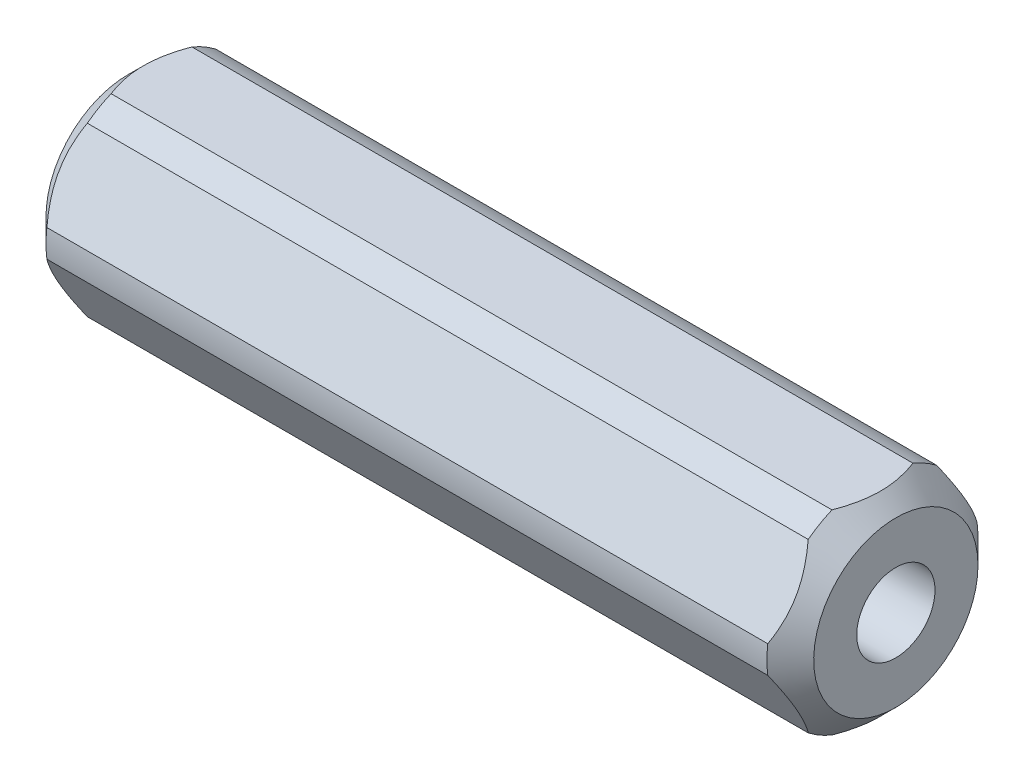
ISO-10303-21;
HEADER;
FILE_DESCRIPTION(('STEP AP214'),'2;1');
FILE_NAME('part.step','',(''),(''),'','','');
FILE_SCHEMA(('AUTOMOTIVE_DESIGN { 1 0 10303 214 1 1 1 1 }'));
ENDSEC;
DATA;
#1=APPLICATION_CONTEXT('core data for automotive mechanical design processes');
#2=APPLICATION_PROTOCOL_DEFINITION('international standard','automotive_design',2000,#1);
#3=PRODUCT_CONTEXT('',#1,'mechanical');
#4=PRODUCT('Part','Part','',(#3));
#5=PRODUCT_RELATED_PRODUCT_CATEGORY('part','',(#4));
#6=PRODUCT_DEFINITION_FORMATION('','',#4);
#7=PRODUCT_DEFINITION_CONTEXT('part definition',#1,'design');
#8=PRODUCT_DEFINITION('design','',#6,#7);
#9=PRODUCT_DEFINITION_SHAPE('','',#8);
#10=(LENGTH_UNIT() NAMED_UNIT(*) SI_UNIT(.MILLI.,.METRE.));
#11=(NAMED_UNIT(*) PLANE_ANGLE_UNIT() SI_UNIT($,.RADIAN.));
#12=(NAMED_UNIT(*) SI_UNIT($,.STERADIAN.) SOLID_ANGLE_UNIT());
#13=UNCERTAINTY_MEASURE_WITH_UNIT(LENGTH_MEASURE(1.E-05),#10,'distance_accuracy_value','');
#14=(GEOMETRIC_REPRESENTATION_CONTEXT(3) GLOBAL_UNCERTAINTY_ASSIGNED_CONTEXT((#13)) GLOBAL_UNIT_ASSIGNED_CONTEXT((#10,
#11,#12)) REPRESENTATION_CONTEXT('',''));
#15=CARTESIAN_POINT('',(0.,0.,0.));
#16=DIRECTION('',(0.,0.,1.));
#17=DIRECTION('',(1.,0.,0.));
#18=AXIS2_PLACEMENT_3D('',#15,#16,#17);
#19=CARTESIAN_POINT('',(25.,0.,0.));
#20=DIRECTION('',(1.,0.,0.));
#21=DIRECTION('',(0.,0.,-1.));
#22=AXIS2_PLACEMENT_3D('',#19,#20,#21);
#23=PLANE('',#22);
#24=CARTESIAN_POINT('',(25.,0.,0.));
#25=DIRECTION('',(1.,0.,0.));
#26=DIRECTION('',(0.,0.,-1.));
#27=AXIS2_PLACEMENT_3D('',#24,#25,#26);
#28=CIRCLE('',#27,2.55);
#29=CARTESIAN_POINT('',(25.,0.,-2.55));
#30=VERTEX_POINT('',#29);
#31=EDGE_CURVE('E264',#30,#30,#28,.T.);
#32=ORIENTED_EDGE('',*,*,#31,.F.);
#33=EDGE_LOOP('',(#32));
#34=FACE_BOUND('',#33,.T.);
#35=CARTESIAN_POINT('',(25.,0.,0.));
#36=DIRECTION('',(1.,0.,0.));
#37=DIRECTION('',(0.,0.,-1.));
#38=AXIS2_PLACEMENT_3D('',#35,#36,#37);
#39=CIRCLE('',#38,5.34999999999999);
#40=CARTESIAN_POINT('',(25.,0.,-5.34999999999999));
#41=VERTEX_POINT('',#40);
#42=EDGE_CURVE('E305',#41,#41,#39,.F.);
#43=ORIENTED_EDGE('',*,*,#42,.F.);
#44=EDGE_LOOP('',(#43));
#45=FACE_BOUND('',#44,.T.);
#46=ADVANCED_FACE('F36',(#34,#45),#23,.T.);
#47=CARTESIAN_POINT('',(-25.,0.,0.));
#48=DIRECTION('',(1.,0.,0.));
#49=DIRECTION('',(0.,0.,-1.));
#50=AXIS2_PLACEMENT_3D('',#47,#48,#49);
#51=PLANE('',#50);
#52=CARTESIAN_POINT('',(-25.,0.,0.));
#53=DIRECTION('',(1.,0.,0.));
#54=DIRECTION('',(0.,0.,-1.));
#55=AXIS2_PLACEMENT_3D('',#52,#53,#54);
#56=CIRCLE('',#55,2.55);
#57=CARTESIAN_POINT('',(-25.,0.,-2.55));
#58=VERTEX_POINT('',#57);
#59=EDGE_CURVE('E267',#58,#58,#56,.T.);
#60=ORIENTED_EDGE('',*,*,#59,.T.);
#61=EDGE_LOOP('',(#60));
#62=FACE_BOUND('',#61,.T.);
#63=CARTESIAN_POINT('',(-25.,0.,0.));
#64=DIRECTION('',(1.,0.,0.));
#65=DIRECTION('',(0.,0.,-1.));
#66=AXIS2_PLACEMENT_3D('',#63,#64,#65);
#67=CIRCLE('',#66,5.35);
#68=CARTESIAN_POINT('',(-25.,0.,-5.35000000000001));
#69=VERTEX_POINT('',#68);
#70=EDGE_CURVE('E261',#69,#69,#67,.F.);
#71=ORIENTED_EDGE('',*,*,#70,.T.);
#72=EDGE_LOOP('',(#71));
#73=FACE_BOUND('',#72,.T.);
#74=ADVANCED_FACE('F237',(#62,#73),#51,.F.);
#75=CARTESIAN_POINT('',(-25.,0.,0.));
#76=DIRECTION('',(1.,0.,0.));
#77=DIRECTION('',(0.,0.,-1.));
#78=AXIS2_PLACEMENT_3D('',#75,#76,#77);
#79=CYLINDRICAL_SURFACE('',#78,2.55);
#80=ORIENTED_EDGE('',*,*,#59,.F.);
#81=EDGE_LOOP('',(#80));
#82=FACE_BOUND('',#81,.T.);
#83=ORIENTED_EDGE('',*,*,#31,.T.);
#84=EDGE_LOOP('',(#83));
#85=FACE_BOUND('',#84,.T.);
#86=ADVANCED_FACE('F194',(#82,#85),#79,.F.);
#87=CARTESIAN_POINT('',(23.,0.,0.));
#88=DIRECTION('',(-1.,0.,0.));
#89=DIRECTION('',(0.,-1.,0.));
#90=AXIS2_PLACEMENT_3D('',#87,#88,#89);
#91=CONICAL_SURFACE('',#90,7.34999999999999,0.78539816339745);
#92=ORIENTED_EDGE('',*,*,#42,.T.);
#93=EDGE_LOOP('',(#92));
#94=FACE_BOUND('',#93,.T.);
#95=CARTESIAN_POINT('',(23.475,0.,0.));
#96=DIRECTION('',(-1.,0.,0.));
#97=DIRECTION('',(0.,-1.,0.));
#98=AXIS2_PLACEMENT_3D('',#95,#96,#97);
#99=CIRCLE('',#98,6.875);
#100=CARTESIAN_POINT('',(23.475,-5.45696050579321,4.18177080173138));
#101=VERTEX_POINT('',#100);
#102=CARTESIAN_POINT('',(23.475,-6.35,2.6349810245997));
#103=VERTEX_POINT('',#102);
#104=EDGE_CURVE('E304',#101,#103,#99,.F.);
#105=ORIENTED_EDGE('',*,*,#104,.T.);
#106=CARTESIAN_POINT('',(22.2439581353573,-6.35,-5.03839406074391));
#107=CARTESIAN_POINT('',(22.3195741219603,-6.35,-4.9167212075727));
#108=CARTESIAN_POINT('',(22.3939976594142,-6.35,-4.79429693604938));
#109=CARTESIAN_POINT('',(22.5400815380457,-6.35,-4.54777236248066));
#110=CARTESIAN_POINT('',(22.61174120379,-6.35,-4.42367166063026));
#111=CARTESIAN_POINT('',(22.7521842054118,-6.35,-4.17314077118514));
#112=CARTESIAN_POINT('',(22.8209537995438,-6.35,-4.04670284391036));
#113=CARTESIAN_POINT('',(22.9547840481854,-6.35,-3.79189401980648));
#114=CARTESIAN_POINT('',(23.0198449411811,-6.35,-3.6635232479405));
#115=CARTESIAN_POINT('',(23.2113872856419,-6.35,-3.26967790405867));
#116=CARTESIAN_POINT('',(23.3311468240079,-6.35,-3.00086462197369));
#117=CARTESIAN_POINT('',(23.5468634656339,-6.35,-2.45416979122341));
#118=CARTESIAN_POINT('',(23.6428635853467,-6.35,-2.17630567708838));
#119=CARTESIAN_POINT('',(23.7687731285972,-6.35,-1.73581597128071));
#120=CARTESIAN_POINT('',(23.8091908547284,-6.35,-1.57618112953531));
#121=CARTESIAN_POINT('',(23.879168231364,-6.35,-1.25450770394683));
#122=CARTESIAN_POINT('',(23.9087273470115,-6.35,-1.09246900210693));
#123=CARTESIAN_POINT('',(23.9556953895091,-6.35,-0.76818847257728));
#124=CARTESIAN_POINT('',(23.9732166504887,-6.35,-0.605963078458843));
#125=CARTESIAN_POINT('',(23.995873484238,-6.35,-0.280640552256999));
#126=CARTESIAN_POINT('',(24.001008734837,-6.35,-0.117543397608938));
#127=CARTESIAN_POINT('',(23.9984538311998,-6.35,0.237960972481487));
#128=CARTESIAN_POINT('',(23.9882863292716,-6.35,0.430354852339885));
#129=CARTESIAN_POINT('',(23.9509477613933,-6.35,0.813488630628858));
#130=CARTESIAN_POINT('',(23.9237732192133,-6.35,1.00422818283275));
#131=CARTESIAN_POINT('',(23.8533898657111,-6.35,1.38527395181799));
#132=CARTESIAN_POINT('',(23.8099755318482,-6.35,1.57554171050399));
#133=CARTESIAN_POINT('',(23.7091558566288,-6.35,1.95224759190602));
#134=CARTESIAN_POINT('',(23.6517527678805,-6.35,2.13868632597373));
#135=CARTESIAN_POINT('',(23.5165670930669,-6.35,2.53217140573025));
#136=CARTESIAN_POINT('',(23.4370839322049,-6.35,2.73862881669699));
#137=CARTESIAN_POINT('',(23.2656657069374,-6.35,3.14635356980783));
#138=CARTESIAN_POINT('',(23.1737249871005,-6.35,3.34761850500479));
#139=CARTESIAN_POINT('',(22.9795333320435,-6.35,3.74587808348406));
#140=CARTESIAN_POINT('',(22.8772500456455,-6.35,3.942856829136));
#141=CARTESIAN_POINT('',(22.6646183582391,-6.35,4.33234428550055));
#142=CARTESIAN_POINT('',(22.5542711855378,-6.35,4.52485367113281));
#143=CARTESIAN_POINT('',(22.3318171829415,-6.35,4.89798257007592));
#144=CARTESIAN_POINT('',(22.2199777355976,-6.35,5.07876232602886));
#145=CARTESIAN_POINT('',(21.9913793968018,-6.35,5.4371942932294));
#146=CARTESIAN_POINT('',(21.874620116551,-6.35,5.61484625571854));
#147=CARTESIAN_POINT('',(21.6380055819828,-6.35,5.96599291825778));
#148=CARTESIAN_POINT('',(21.5181827719405,-6.35,6.13950956033397));
#149=CARTESIAN_POINT('',(21.2752175514028,-6.35,6.48413143949801));
#150=CARTESIAN_POINT('',(21.1520761006711,-6.35,6.65523735243475));
#151=CARTESIAN_POINT('',(21.0275740883058,-6.35,6.825329653506));
#152=B_SPLINE_CURVE_WITH_KNOTS('',3,(#106,#107,#108,#109,#110,#111,#112,#113,#114,#115,#116,
#117,#118,#119,#120,#121,#122,#123,#124,#125,#126,#127,#128,#129,#130,#131,#132,#133,#134,#135,
#136,#137,#138,#139,#140,#141,#142,#143,#144,#145,#146,#147,#148,#149,#150,#151),.UNSPECIFIED.,
.F.,.F.,(4,2,2,2,2,2,2,2,2,2,2,2,2,2,2,2,2,2,2,2,2,2,4),(0.,0.429771247154591,0.859646864545559,
1.29137691978356,1.72307918145949,2.60508831723376,3.48548869672243,3.97918678889613,
4.47290919564488,4.96195934269227,5.45102221021652,6.02819613408464,6.60548807054104,
7.19034769458147,7.77511320088765,8.43829025301613,9.10176938660425,9.76739213074458,
10.4329136964041,11.0705543641275,11.708245517429,12.3408089752114,12.9731914158771),.UNSPECIFIED.);
#153=CARTESIAN_POINT('',(23.475,-6.34999999999999,-2.6349810245996));
#154=VERTEX_POINT('',#153);
#155=EDGE_CURVE('E216',#154,#103,#152,.T.);
#156=ORIENTED_EDGE('',*,*,#155,.F.);
#157=CARTESIAN_POINT('',(23.475,0.,0.));
#158=DIRECTION('',(-1.,0.,0.));
#159=DIRECTION('',(0.,-1.,0.));
#160=AXIS2_PLACEMENT_3D('',#157,#158,#159);
#161=CIRCLE('',#160,6.875);
#162=CARTESIAN_POINT('',(23.475,-5.45696050579321,-4.18177080173139));
#163=VERTEX_POINT('',#162);
#164=EDGE_CURVE('E160',#154,#163,#161,.F.);
#165=ORIENTED_EDGE('',*,*,#164,.T.);
#166=CARTESIAN_POINT('',(23.4749114842835,-0.892839494206784,-6.81686729638483));
#167=CARTESIAN_POINT('',(23.5544158158132,-1.07236532873137,-6.71321800749557));
#168=CARTESIAN_POINT('',(23.6269587202094,-1.25442679768724,-6.60810476938484));
#169=CARTESIAN_POINT('',(23.7552276765301,-1.62345297783122,-6.39504740494069));
#170=CARTESIAN_POINT('',(23.810907023712,-1.81042977564499,-6.2870963003907));
#171=CARTESIAN_POINT('',(23.9004237178134,-2.1812459243031,-6.07300549714308));
#172=CARTESIAN_POINT('',(23.9349828781156,-2.36495142475234,-5.9669430770071));
#173=CARTESIAN_POINT('',(23.9831473488082,-2.73419034728063,-5.7537628856901));
#174=CARTESIAN_POINT('',(23.9967809062925,-2.91972096436872,-5.64664673397137));
#175=CARTESIAN_POINT('',(24.0023641784298,-3.30218953927796,-5.42582839929095));
#176=CARTESIAN_POINT('',(23.9929632444641,-3.49914377711882,-5.31211681705549));
#177=CARTESIAN_POINT('',(23.9503316355953,-3.89135821622141,-5.08567170505955));
#178=CARTESIAN_POINT('',(23.9170641655358,-4.08661532999935,-4.97293995785867));
#179=CARTESIAN_POINT('',(23.8273191931289,-4.48116785790707,-4.7451449496617));
#180=CARTESIAN_POINT('',(23.7699660135684,-4.68031210853098,-4.63016896295642));
#181=CARTESIAN_POINT('',(23.6694106682599,-4.97489640720418,-4.46009063881842));
#182=CARTESIAN_POINT('',(23.6335267488458,-5.07227985912123,-4.40386627663949));
#183=CARTESIAN_POINT('',(23.5573860772987,-5.26571176805271,-4.29218831194804));
#184=CARTESIAN_POINT('',(23.5171312192409,-5.36176078313213,-4.23673438723654));
#185=CARTESIAN_POINT('',(23.4749114842835,-5.45716050579321,-4.18165533167755));
#186=B_SPLINE_CURVE_WITH_KNOTS('',3,(#166,#167,#168,#169,#170,#171,#172,#173,#174,#175,#176,
#177,#178,#179,#180,#181,#182,#183,#184,#185),.UNSPECIFIED.,.F.,.F.,(4,2,2,2,2,2,2,2,2,4),(0.,
0.666305152357756,1.33443915250483,1.9782328854584,2.62115680616373,3.30267097356111,
3.9852380988712,4.69512464711033,5.04915819200856,5.40303892990316),.UNSPECIFIED.);
#187=CARTESIAN_POINT('',(23.475,-0.893039494206784,-6.81675182633099));
#188=VERTEX_POINT('',#187);
#189=EDGE_CURVE('E168',#188,#163,#186,.T.);
#190=ORIENTED_EDGE('',*,*,#189,.F.);
#191=CARTESIAN_POINT('',(23.475,0.,0.));
#192=DIRECTION('',(-1.,0.,0.));
#193=DIRECTION('',(0.,-1.,0.));
#194=AXIS2_PLACEMENT_3D('',#191,#192,#193);
#195=CIRCLE('',#194,6.875);
#196=CARTESIAN_POINT('',(23.475,0.893039494206792,-6.81675182633099));
#197=VERTEX_POINT('',#196);
#198=EDGE_CURVE('E175',#188,#197,#195,.F.);
#199=ORIENTED_EDGE('',*,*,#198,.T.);
#200=CARTESIAN_POINT('',(23.4749114842835,5.45716050579321,-4.18165533167754));
#201=CARTESIAN_POINT('',(23.5544158158132,5.27763467126862,-4.2853046205668));
#202=CARTESIAN_POINT('',(23.6269587202094,5.09557320231276,-4.39041785867753));
#203=CARTESIAN_POINT('',(23.7552276765301,4.72654702216877,-4.60347522312168));
#204=CARTESIAN_POINT('',(23.810907023712,4.539570224355,-4.71142632767168));
#205=CARTESIAN_POINT('',(23.9004237178134,4.1687540756969,-4.92551713091929));
#206=CARTESIAN_POINT('',(23.9349828781156,3.98504857524766,-5.03157955105527));
#207=CARTESIAN_POINT('',(23.9831473488082,3.61580965271937,-5.24475974237227));
#208=CARTESIAN_POINT('',(23.9967809062925,3.43027903563128,-5.351875894091));
#209=CARTESIAN_POINT('',(24.0023641784299,3.04781046072203,-5.57269422877142));
#210=CARTESIAN_POINT('',(23.9929632444641,2.85085622288117,-5.68640581100688));
#211=CARTESIAN_POINT('',(23.9503316355953,2.45864178377859,-5.91285092300282));
#212=CARTESIAN_POINT('',(23.9170641655358,2.26338467000065,-6.0255826702037));
#213=CARTESIAN_POINT('',(23.8273191931289,1.86883214209293,-6.25337767840067));
#214=CARTESIAN_POINT('',(23.7699660135684,1.66968789146901,-6.36835366510595));
#215=CARTESIAN_POINT('',(23.6694106682599,1.37510359279582,-6.53843198924396));
#216=CARTESIAN_POINT('',(23.6335267488458,1.27772014087877,-6.59465635142289));
#217=CARTESIAN_POINT('',(23.5573860772987,1.08428823194729,-6.70633431611434));
#218=CARTESIAN_POINT('',(23.5171312192409,0.988239216867873,-6.76178824082584));
#219=CARTESIAN_POINT('',(23.4749114842835,0.892839494206794,-6.81686729638483));
#220=B_SPLINE_CURVE_WITH_KNOTS('',3,(#200,#201,#202,#203,#204,#205,#206,#207,#208,#209,#210,
#211,#212,#213,#214,#215,#216,#217,#218,#219),.UNSPECIFIED.,.F.,.F.,(4,2,2,2,2,2,2,2,2,4),(0.,
0.666305152357755,1.33443915250483,1.9782328854584,2.62115680616373,3.30267097356111,
3.9852380988712,4.69512464711033,5.04915819200856,5.40303892990316),.UNSPECIFIED.);
#221=CARTESIAN_POINT('',(23.475,5.45696050579321,-4.18177080173138));
#222=VERTEX_POINT('',#221);
#223=EDGE_CURVE('E59',#222,#197,#220,.T.);
#224=ORIENTED_EDGE('',*,*,#223,.F.);
#225=CARTESIAN_POINT('',(23.475,0.,0.));
#226=DIRECTION('',(-1.,0.,0.));
#227=DIRECTION('',(0.,-1.,0.));
#228=AXIS2_PLACEMENT_3D('',#225,#226,#227);
#229=CIRCLE('',#228,6.875);
#230=CARTESIAN_POINT('',(23.475,6.35000000000001,-2.63498102459961));
#231=VERTEX_POINT('',#230);
#232=EDGE_CURVE('E45',#222,#231,#229,.F.);
#233=ORIENTED_EDGE('',*,*,#232,.T.);
#234=CARTESIAN_POINT('',(22.2439581353433,6.35,-5.03839406076657));
#235=CARTESIAN_POINT('',(22.3195741219468,6.35,-4.91672120759479));
#236=CARTESIAN_POINT('',(22.3939976594013,6.35,-4.79429693607089));
#237=CARTESIAN_POINT('',(22.5400815380339,6.35,-4.547772362501));
#238=CARTESIAN_POINT('',(22.6117412037787,6.35,-4.42367166065001));
#239=CARTESIAN_POINT('',(22.7521842054017,6.35,-4.17314077120369));
#240=CARTESIAN_POINT('',(22.8209537995342,6.35,-4.04670284392831));
#241=CARTESIAN_POINT('',(22.9547840481769,6.35,-3.79189401982319));
#242=CARTESIAN_POINT('',(23.0198449411731,6.35,-3.66352324795659));
#243=CARTESIAN_POINT('',(23.2113872856354,6.35,-3.26967790407277));
#244=CARTESIAN_POINT('',(23.3311468240025,6.35,-3.00086462198639));
#245=CARTESIAN_POINT('',(23.5468634656304,6.35,-2.45416979123321));
#246=CARTESIAN_POINT('',(23.6428635853441,6.35,-2.17630567709667));
#247=CARTESIAN_POINT('',(23.7687731285957,6.35,-1.7358159712863));
#248=CARTESIAN_POINT('',(23.8091908547273,6.35,-1.57618112953974));
#249=CARTESIAN_POINT('',(23.8791682313636,6.35,-1.2545077039489));
#250=CARTESIAN_POINT('',(23.9087273470114,6.35,-1.09246900210779));
#251=CARTESIAN_POINT('',(23.9556953895093,6.35,-0.768188472575736));
#252=CARTESIAN_POINT('',(23.973216650489,6.35,-0.605963078456098));
#253=CARTESIAN_POINT('',(23.9958734842382,6.35,-0.280640552251845));
#254=CARTESIAN_POINT('',(24.0010087348371,6.35,-0.117543397602577));
#255=CARTESIAN_POINT('',(23.9984538311996,6.35,0.237960972488081));
#256=CARTESIAN_POINT('',(23.9882863292712,6.35,0.430354852345502));
#257=CARTESIAN_POINT('',(23.9509477613928,6.35,0.813488630632527));
#258=CARTESIAN_POINT('',(23.9237732192128,6.35,1.00422818283544));
#259=CARTESIAN_POINT('',(23.853389865711,6.35,1.38527395181875));
#260=CARTESIAN_POINT('',(23.8099755318482,6.35,1.57554171050378));
#261=CARTESIAN_POINT('',(23.7091558566294,6.35,1.95224759190391));
#262=CARTESIAN_POINT('',(23.6517527678814,6.35,2.13868632597069));
#263=CARTESIAN_POINT('',(23.5165670930685,6.35,2.53217140572596));
#264=CARTESIAN_POINT('',(23.4370839322068,6.35,2.73862881669236));
#265=CARTESIAN_POINT('',(23.2656657069397,6.35,3.14635356980255));
#266=CARTESIAN_POINT('',(23.1737249871031,6.35,3.34761850499919));
#267=CARTESIAN_POINT('',(22.9795333320466,6.35,3.74587808347784));
#268=CARTESIAN_POINT('',(22.877250045649,6.35,3.94285682912947));
#269=CARTESIAN_POINT('',(22.6646183582432,6.35,4.33234428549342));
#270=CARTESIAN_POINT('',(22.5542711855421,6.35,4.52485367112538));
#271=CARTESIAN_POINT('',(22.3318171829464,6.35,4.89798257006795));
#272=CARTESIAN_POINT('',(22.2199777356027,6.35,5.07876232602065));
#273=CARTESIAN_POINT('',(21.9913793968074,6.35,5.43719429322071));
#274=CARTESIAN_POINT('',(21.8746201165569,6.35,5.61484625570961));
#275=CARTESIAN_POINT('',(21.6380055819892,6.35,5.96599291824838));
#276=CARTESIAN_POINT('',(21.5181827719472,6.35,6.13950956032433));
#277=CARTESIAN_POINT('',(21.2752175514101,6.35,6.48413143948791));
#278=CARTESIAN_POINT('',(21.1520761006786,6.35,6.65523735242441));
#279=CARTESIAN_POINT('',(21.0275740883135,6.35,6.82532965349543));
#280=B_SPLINE_CURVE_WITH_KNOTS('',3,(#234,#235,#236,#237,#238,#239,#240,#241,#242,#243,#244,
#245,#246,#247,#248,#249,#250,#251,#252,#253,#254,#255,#256,#257,#258,#259,#260,#261,#262,#263,
#264,#265,#266,#267,#268,#269,#270,#271,#272,#273,#274,#275,#276,#277,#278,#279),.UNSPECIFIED.,
.F.,.F.,(4,2,2,2,2,2,2,2,2,2,2,2,2,2,2,2,2,2,2,2,2,2,4),(0.,0.429771247156948,0.859646864550278,
1.29137691979066,1.72307918146898,2.60508831724835,3.4854886967421,3.97918678891948,
4.47290919567191,4.9619593427229,5.45102221025075,6.02819613411598,6.60548807056948,
7.19034769460694,7.77511320091016,8.43829025303743,9.10176938662435,9.76739213076348,
10.4329136964218,11.0705543641441,11.7082455174446,12.340808975226,12.9731914158907),.UNSPECIFIED.);
#281=CARTESIAN_POINT('',(23.475,6.35,2.63498102459971));
#282=VERTEX_POINT('',#281);
#283=EDGE_CURVE('E124',#282,#231,#280,.F.);
#284=ORIENTED_EDGE('',*,*,#283,.F.);
#285=CARTESIAN_POINT('',(23.475,0.,0.));
#286=DIRECTION('',(-1.,0.,0.));
#287=DIRECTION('',(0.,-1.,0.));
#288=AXIS2_PLACEMENT_3D('',#285,#286,#287);
#289=CIRCLE('',#288,6.875);
#290=CARTESIAN_POINT('',(23.475,5.45696050579321,4.18177080173139));
#291=VERTEX_POINT('',#290);
#292=EDGE_CURVE('E288',#282,#291,#289,.F.);
#293=ORIENTED_EDGE('',*,*,#292,.T.);
#294=CARTESIAN_POINT('',(23.4749114842835,0.892839494206787,6.81686729638483));
#295=CARTESIAN_POINT('',(23.5544158158132,1.07236532873137,6.71321800749557));
#296=CARTESIAN_POINT('',(23.6269587202094,1.25442679768724,6.60810476938484));
#297=CARTESIAN_POINT('',(23.7552276765301,1.62345297783123,6.39504740494069));
#298=CARTESIAN_POINT('',(23.810907023712,1.810429775645,6.28709630039069));
#299=CARTESIAN_POINT('',(23.9004237178134,2.1812459243031,6.07300549714308));
#300=CARTESIAN_POINT('',(23.9349828781156,2.36495142475234,5.96694307700709));
#301=CARTESIAN_POINT('',(23.9831473488082,2.73419034728064,5.7537628856901));
#302=CARTESIAN_POINT('',(23.9967809062925,2.91972096436873,5.64664673397137));
#303=CARTESIAN_POINT('',(24.0023641784299,3.30218953927797,5.42582839929094));
#304=CARTESIAN_POINT('',(23.9929632444641,3.49914377711883,5.31211681705549));
#305=CARTESIAN_POINT('',(23.9503316355953,3.89135821622142,5.08567170505955));
#306=CARTESIAN_POINT('',(23.9170641655358,4.08661532999935,4.97293995785867));
#307=CARTESIAN_POINT('',(23.8273191931289,4.48116785790707,4.7451449496617));
#308=CARTESIAN_POINT('',(23.7699660135684,4.68031210853099,4.63016896295642));
#309=CARTESIAN_POINT('',(23.6694106682599,4.97489640720418,4.46009063881842));
#310=CARTESIAN_POINT('',(23.6335267488458,5.07227985912123,4.40386627663949));
#311=CARTESIAN_POINT('',(23.5573860772987,5.26571176805271,4.29218831194804));
#312=CARTESIAN_POINT('',(23.5171312192409,5.36176078313212,4.23673438723654));
#313=CARTESIAN_POINT('',(23.4749114842835,5.4571605057932,4.18165533167755));
#314=B_SPLINE_CURVE_WITH_KNOTS('',3,(#294,#295,#296,#297,#298,#299,#300,#301,#302,#303,#304,
#305,#306,#307,#308,#309,#310,#311,#312,#313),.UNSPECIFIED.,.F.,.F.,(4,2,2,2,2,2,2,2,2,4),(0.,
0.666305152357759,1.33443915250484,1.97823288545841,2.62115680616374,3.30267097356112,
3.9852380988712,4.69512464711033,5.04915819200856,5.40303892990316),.UNSPECIFIED.);
#315=CARTESIAN_POINT('',(23.475,0.893039494206786,6.81675182633099));
#316=VERTEX_POINT('',#315);
#317=EDGE_CURVE('E171',#316,#291,#314,.T.);
#318=ORIENTED_EDGE('',*,*,#317,.F.);
#319=CARTESIAN_POINT('',(23.475,0.,0.));
#320=DIRECTION('',(-1.,0.,0.));
#321=DIRECTION('',(0.,-1.,0.));
#322=AXIS2_PLACEMENT_3D('',#319,#320,#321);
#323=CIRCLE('',#322,6.875);
#324=CARTESIAN_POINT('',(23.475,-0.893039494206794,6.81675182633099));
#325=VERTEX_POINT('',#324);
#326=EDGE_CURVE('E170',#316,#325,#323,.F.);
#327=ORIENTED_EDGE('',*,*,#326,.T.);
#328=CARTESIAN_POINT('',(23.4749114842835,-5.45716050579321,4.18165533167754));
#329=CARTESIAN_POINT('',(23.5544158158132,-5.27763467126863,4.2853046205668));
#330=CARTESIAN_POINT('',(23.6269587202094,-5.09557320231276,4.39041785867753));
#331=CARTESIAN_POINT('',(23.7552276765301,-4.72654702216877,4.60347522312168));
#332=CARTESIAN_POINT('',(23.810907023712,-4.539570224355,4.71142632767168));
#333=CARTESIAN_POINT('',(23.9004237178134,-4.1687540756969,4.92551713091929));
#334=CARTESIAN_POINT('',(23.9349828781156,-3.98504857524766,5.03157955105528));
#335=CARTESIAN_POINT('',(23.9831473488082,-3.61580965271936,5.24475974237227));
#336=CARTESIAN_POINT('',(23.9967809062925,-3.43027903563127,5.351875894091));
#337=CARTESIAN_POINT('',(24.0023641784298,-3.04781046072203,5.57269422877143));
#338=CARTESIAN_POINT('',(23.9929632444641,-2.85085622288117,5.68640581100689));
#339=CARTESIAN_POINT('',(23.9503316355953,-2.45864178377858,5.91285092300282));
#340=CARTESIAN_POINT('',(23.9170641655358,-2.26338467000065,6.0255826702037));
#341=CARTESIAN_POINT('',(23.8273191931289,-1.86883214209293,6.25337767840067));
#342=CARTESIAN_POINT('',(23.7699660135684,-1.66968789146901,6.36835366510596));
#343=CARTESIAN_POINT('',(23.6694106682599,-1.37510359279582,6.53843198924396));
#344=CARTESIAN_POINT('',(23.6335267488458,-1.27772014087877,6.59465635142289));
#345=CARTESIAN_POINT('',(23.5573860772987,-1.08428823194729,6.70633431611434));
#346=CARTESIAN_POINT('',(23.5171312192409,-0.988239216867874,6.76178824082584));
#347=CARTESIAN_POINT('',(23.4749114842835,-0.892839494206794,6.81686729638483));
#348=B_SPLINE_CURVE_WITH_KNOTS('',3,(#328,#329,#330,#331,#332,#333,#334,#335,#336,#337,#338,
#339,#340,#341,#342,#343,#344,#345,#346,#347),.UNSPECIFIED.,.F.,.F.,(4,2,2,2,2,2,2,2,2,4),(0.,
0.666305152357758,1.33443915250484,1.97823288545841,2.62115680616374,3.30267097356112,
3.9852380988712,4.69512464711033,5.04915819200856,5.40303892990316),.UNSPECIFIED.);
#349=EDGE_CURVE('E223',#101,#325,#348,.T.);
#350=ORIENTED_EDGE('',*,*,#349,.F.);
#351=EDGE_LOOP('',(#105,#156,#165,#190,#199,#224,#233,#284,#293,#318,#327,#350));
#352=FACE_BOUND('',#351,.T.);
#353=ADVANCED_FACE('F123',(#94,#352),#91,.T.);
#354=CARTESIAN_POINT('',(-26.,0.,0.));
#355=DIRECTION('',(1.,0.,0.));
#356=DIRECTION('',(0.,1.,0.));
#357=AXIS2_PLACEMENT_3D('',#354,#355,#356);
#358=CONICAL_SURFACE('',#357,4.35000000000001,0.785398163397448);
#359=CARTESIAN_POINT('',(-23.475,0.,0.));
#360=DIRECTION('',(1.,0.,0.));
#361=DIRECTION('',(0.,1.,0.));
#362=AXIS2_PLACEMENT_3D('',#359,#360,#361);
#363=CIRCLE('',#362,6.875);
#364=CARTESIAN_POINT('',(-23.475,-6.35,2.6349810245997));
#365=VERTEX_POINT('',#364);
#366=CARTESIAN_POINT('',(-23.475,-5.45696050579321,4.18177080173138));
#367=VERTEX_POINT('',#366);
#368=EDGE_CURVE('E259',#365,#367,#363,.F.);
#369=ORIENTED_EDGE('',*,*,#368,.T.);
#370=CARTESIAN_POINT('',(-23.4749114842835,-0.892839494206794,6.81686729638483));
#371=CARTESIAN_POINT('',(-23.5544158158132,-1.07236532873138,6.71321800749557));
#372=CARTESIAN_POINT('',(-23.6269587202094,-1.25442679768725,6.60810476938484));
#373=CARTESIAN_POINT('',(-23.7552276765301,-1.62345297783123,6.39504740494069));
#374=CARTESIAN_POINT('',(-23.810907023712,-1.810429775645,6.28709630039069));
#375=CARTESIAN_POINT('',(-23.9004237178134,-2.1812459243031,6.07300549714308));
#376=CARTESIAN_POINT('',(-23.9349828781156,-2.36495142475234,5.96694307700709));
#377=CARTESIAN_POINT('',(-23.9831473488082,-2.73419034728063,5.7537628856901));
#378=CARTESIAN_POINT('',(-23.9967809062925,-2.91972096436872,5.64664673397137));
#379=CARTESIAN_POINT('',(-24.0023641784299,-3.30218953927797,5.42582839929095));
#380=CARTESIAN_POINT('',(-23.9929632444641,-3.49914377711883,5.31211681705549));
#381=CARTESIAN_POINT('',(-23.9503316355953,-3.89135821622142,5.08567170505955));
#382=CARTESIAN_POINT('',(-23.9170641655358,-4.08661532999935,4.97293995785867));
#383=CARTESIAN_POINT('',(-23.8273191931289,-4.48116785790707,4.7451449496617));
#384=CARTESIAN_POINT('',(-23.7699660135684,-4.68031210853099,4.63016896295641));
#385=CARTESIAN_POINT('',(-23.6694106682599,-4.97489640720418,4.46009063881841));
#386=CARTESIAN_POINT('',(-23.6335267488459,-5.07227985912124,4.40386627663948));
#387=CARTESIAN_POINT('',(-23.5573860772987,-5.26571176805271,4.29218831194803));
#388=CARTESIAN_POINT('',(-23.5171312192409,-5.36176078313213,4.23673438723653));
#389=CARTESIAN_POINT('',(-23.4749114842835,-5.45716050579321,4.18165533167754));
#390=B_SPLINE_CURVE_WITH_KNOTS('',3,(#370,#371,#372,#373,#374,#375,#376,#377,#378,#379,#380,
#381,#382,#383,#384,#385,#386,#387,#388,#389),.UNSPECIFIED.,.F.,.F.,(4,2,2,2,2,2,2,2,2,4),(0.,
0.666305152357755,1.33443915250483,1.9782328854584,2.62115680616373,3.30267097356111,
3.9852380988712,4.69512464711033,5.04915819200856,5.40303892990316),.UNSPECIFIED.);
#391=CARTESIAN_POINT('',(-23.475,-0.893039494206795,6.81675182633099));
#392=VERTEX_POINT('',#391);
#393=EDGE_CURVE('E251',#392,#367,#390,.T.);
#394=ORIENTED_EDGE('',*,*,#393,.F.);
#395=CARTESIAN_POINT('',(-23.475,0.,0.));
#396=DIRECTION('',(1.,0.,0.));
#397=DIRECTION('',(0.,1.,0.));
#398=AXIS2_PLACEMENT_3D('',#395,#396,#397);
#399=CIRCLE('',#398,6.875);
#400=CARTESIAN_POINT('',(-23.475,0.893039494206787,6.81675182633099));
#401=VERTEX_POINT('',#400);
#402=EDGE_CURVE('E300',#392,#401,#399,.F.);
#403=ORIENTED_EDGE('',*,*,#402,.T.);
#404=CARTESIAN_POINT('',(-23.4749114842835,5.4571605057932,4.18165533167755));
#405=CARTESIAN_POINT('',(-23.5544158158132,5.27763467126862,4.28530462056681));
#406=CARTESIAN_POINT('',(-23.6269587202094,5.09557320231275,4.39041785867754));
#407=CARTESIAN_POINT('',(-23.7552276765301,4.72654702216877,4.60347522312169));
#408=CARTESIAN_POINT('',(-23.810907023712,4.539570224355,4.71142632767168));
#409=CARTESIAN_POINT('',(-23.9004237178134,4.1687540756969,4.9255171309193));
#410=CARTESIAN_POINT('',(-23.9349828781156,3.98504857524766,5.03157955105528));
#411=CARTESIAN_POINT('',(-23.9831473488082,3.61580965271936,5.24475974237228));
#412=CARTESIAN_POINT('',(-23.9967809062925,3.43027903563127,5.351875894091));
#413=CARTESIAN_POINT('',(-24.0023641784299,3.04781046072203,5.57269422877143));
#414=CARTESIAN_POINT('',(-23.9929632444641,2.85085622288117,5.68640581100689));
#415=CARTESIAN_POINT('',(-23.9503316355953,2.45864178377858,5.91285092300282));
#416=CARTESIAN_POINT('',(-23.9170641655358,2.26338467000065,6.0255826702037));
#417=CARTESIAN_POINT('',(-23.8273191931289,1.86883214209292,6.25337767840067));
#418=CARTESIAN_POINT('',(-23.7699660135684,1.66968789146901,6.36835366510596));
#419=CARTESIAN_POINT('',(-23.6694106682599,1.37510359279582,6.53843198924396));
#420=CARTESIAN_POINT('',(-23.6335267488459,1.27772014087876,6.59465635142289));
#421=CARTESIAN_POINT('',(-23.5573860772987,1.08428823194729,6.70633431611434));
#422=CARTESIAN_POINT('',(-23.5171312192409,0.988239216867868,6.76178824082584));
#423=CARTESIAN_POINT('',(-23.4749114842835,0.892839494206788,6.81686729638483));
#424=B_SPLINE_CURVE_WITH_KNOTS('',3,(#404,#405,#406,#407,#408,#409,#410,#411,#412,#413,#414,
#415,#416,#417,#418,#419,#420,#421,#422,#423),.UNSPECIFIED.,.F.,.F.,(4,2,2,2,2,2,2,2,2,4),(0.,
0.666305152357755,1.33443915250483,1.9782328854584,2.62115680616373,3.30267097356111,
3.9852380988712,4.69512464711033,5.04915819200856,5.40303892990316),.UNSPECIFIED.);
#425=CARTESIAN_POINT('',(-23.475,5.4569605057932,4.18177080173138));
#426=VERTEX_POINT('',#425);
#427=EDGE_CURVE('E294',#426,#401,#424,.T.);
#428=ORIENTED_EDGE('',*,*,#427,.F.);
#429=CARTESIAN_POINT('',(-23.475,0.,0.));
#430=DIRECTION('',(1.,0.,0.));
#431=DIRECTION('',(0.,1.,0.));
#432=AXIS2_PLACEMENT_3D('',#429,#430,#431);
#433=CIRCLE('',#432,6.875);
#434=CARTESIAN_POINT('',(-23.475,6.35,2.63498102459971));
#435=VERTEX_POINT('',#434);
#436=EDGE_CURVE('E289',#426,#435,#433,.F.);
#437=ORIENTED_EDGE('',*,*,#436,.T.);
#438=CARTESIAN_POINT('',(-22.2439581353433,6.35,-5.03839406076657));
#439=CARTESIAN_POINT('',(-22.3195741219468,6.35,-4.91672120759478));
#440=CARTESIAN_POINT('',(-22.3939976594013,6.35,-4.79429693607089));
#441=CARTESIAN_POINT('',(-22.5400815380339,6.35,-4.547772362501));
#442=CARTESIAN_POINT('',(-22.6117412037787,6.35,-4.42367166065001));
#443=CARTESIAN_POINT('',(-22.7521842054017,6.35,-4.17314077120369));
#444=CARTESIAN_POINT('',(-22.8209537995342,6.35,-4.04670284392831));
#445=CARTESIAN_POINT('',(-22.9547840481769,6.35,-3.79189401982319));
#446=CARTESIAN_POINT('',(-23.0198449411731,6.35,-3.66352324795659));
#447=CARTESIAN_POINT('',(-23.2113872856354,6.35,-3.26967790407277));
#448=CARTESIAN_POINT('',(-23.3311468240025,6.35,-3.00086462198639));
#449=CARTESIAN_POINT('',(-23.5468634656304,6.35,-2.45416979123321));
#450=CARTESIAN_POINT('',(-23.6428635853441,6.35,-2.17630567709667));
#451=CARTESIAN_POINT('',(-23.7687731285957,6.35,-1.7358159712863));
#452=CARTESIAN_POINT('',(-23.8091908547273,6.35,-1.57618112953974));
#453=CARTESIAN_POINT('',(-23.8791682313636,6.35,-1.25450770394889));
#454=CARTESIAN_POINT('',(-23.9087273470114,6.35,-1.09246900210779));
#455=CARTESIAN_POINT('',(-23.9556953895093,6.35,-0.768188472575734));
#456=CARTESIAN_POINT('',(-23.973216650489,6.35,-0.605963078456094));
#457=CARTESIAN_POINT('',(-23.9958734842382,6.35,-0.28064055225184));
#458=CARTESIAN_POINT('',(-24.0010087348371,6.35,-0.117543397602571));
#459=CARTESIAN_POINT('',(-23.9984538311996,6.35,0.237960972488087));
#460=CARTESIAN_POINT('',(-23.9882863292712,6.35,0.430354852345508));
#461=CARTESIAN_POINT('',(-23.9509477613928,6.35,0.813488630632533));
#462=CARTESIAN_POINT('',(-23.9237732192128,6.35,1.00422818283545));
#463=CARTESIAN_POINT('',(-23.853389865711,6.35,1.38527395181875));
#464=CARTESIAN_POINT('',(-23.8099755318482,6.35,1.57554171050378));
#465=CARTESIAN_POINT('',(-23.7091558566294,6.35,1.95224759190392));
#466=CARTESIAN_POINT('',(-23.6517527678814,6.35,2.13868632597069));
#467=CARTESIAN_POINT('',(-23.5165670930685,6.35,2.53217140572596));
#468=CARTESIAN_POINT('',(-23.4370839322068,6.35,2.73862881669236));
#469=CARTESIAN_POINT('',(-23.2656657069397,6.35,3.14635356980255));
#470=CARTESIAN_POINT('',(-23.1737249871031,6.35,3.34761850499919));
#471=CARTESIAN_POINT('',(-22.9795333320466,6.35,3.74587808347783));
#472=CARTESIAN_POINT('',(-22.877250045649,6.35,3.94285682912947));
#473=CARTESIAN_POINT('',(-22.6646183582432,6.35,4.33234428549341));
#474=CARTESIAN_POINT('',(-22.5542711855421,6.35,4.52485367112537));
#475=CARTESIAN_POINT('',(-22.3318171829464,6.35,4.89798257006795));
#476=CARTESIAN_POINT('',(-22.2199777356027,6.35,5.07876232602064));
#477=CARTESIAN_POINT('',(-21.9913793968074,6.35,5.43719429322071));
#478=CARTESIAN_POINT('',(-21.8746201165569,6.35,5.61484625570961));
#479=CARTESIAN_POINT('',(-21.6380055819892,6.35,5.96599291824837));
#480=CARTESIAN_POINT('',(-21.5181827719472,6.35,6.13950956032432));
#481=CARTESIAN_POINT('',(-21.2752175514101,6.35,6.4841314394879));
#482=CARTESIAN_POINT('',(-21.1520761006786,6.35,6.6552373524244));
#483=CARTESIAN_POINT('',(-21.0275740883135,6.35,6.82532965349542));
#484=B_SPLINE_CURVE_WITH_KNOTS('',3,(#438,#439,#440,#441,#442,#443,#444,#445,#446,#447,#448,
#449,#450,#451,#452,#453,#454,#455,#456,#457,#458,#459,#460,#461,#462,#463,#464,#465,#466,#467,
#468,#469,#470,#471,#472,#473,#474,#475,#476,#477,#478,#479,#480,#481,#482,#483),.UNSPECIFIED.,
.F.,.F.,(4,2,2,2,2,2,2,2,2,2,2,2,2,2,2,2,2,2,2,2,2,2,4),(0.,0.429771247156948,0.859646864550277,
1.29137691979066,1.72307918146898,2.60508831724835,3.48548869674209,3.97918678891948,
4.47290919567191,4.9619593427229,5.45102221025075,6.02819613411598,6.60548807056948,
7.19034769460694,7.77511320091015,8.43829025303743,9.10176938662435,9.76739213076347,
10.4329136964218,11.0705543641441,11.7082455174446,12.340808975226,12.9731914158907),.UNSPECIFIED.);
#485=CARTESIAN_POINT('',(-23.475,6.35,-2.63498102459961));
#486=VERTEX_POINT('',#485);
#487=EDGE_CURVE('E51',#486,#435,#484,.T.);
#488=ORIENTED_EDGE('',*,*,#487,.F.);
#489=CARTESIAN_POINT('',(-23.475,0.,0.));
#490=DIRECTION('',(1.,0.,0.));
#491=DIRECTION('',(0.,1.,0.));
#492=AXIS2_PLACEMENT_3D('',#489,#490,#491);
#493=CIRCLE('',#492,6.875);
#494=CARTESIAN_POINT('',(-23.475,5.45696050579321,-4.18177080173138));
#495=VERTEX_POINT('',#494);
#496=EDGE_CURVE('E11',#486,#495,#493,.F.);
#497=ORIENTED_EDGE('',*,*,#496,.T.);
#498=CARTESIAN_POINT('',(-23.4749114842835,0.892839494206793,-6.81686729638483));
#499=CARTESIAN_POINT('',(-23.5544158158132,1.07236532873138,-6.71321800749557));
#500=CARTESIAN_POINT('',(-23.6269587202094,1.25442679768724,-6.60810476938484));
#501=CARTESIAN_POINT('',(-23.7552276765301,1.62345297783123,-6.39504740494069));
#502=CARTESIAN_POINT('',(-23.810907023712,1.810429775645,-6.28709630039069));
#503=CARTESIAN_POINT('',(-23.9004237178134,2.1812459243031,-6.07300549714308));
#504=CARTESIAN_POINT('',(-23.9349828781156,2.36495142475234,-5.9669430770071));
#505=CARTESIAN_POINT('',(-23.9831473488082,2.73419034728063,-5.7537628856901));
#506=CARTESIAN_POINT('',(-23.9967809062925,2.91972096436872,-5.64664673397137));
#507=CARTESIAN_POINT('',(-24.0023641784299,3.30218953927796,-5.42582839929095));
#508=CARTESIAN_POINT('',(-23.9929632444641,3.49914377711882,-5.31211681705549));
#509=CARTESIAN_POINT('',(-23.9503316355953,3.89135821622141,-5.08567170505955));
#510=CARTESIAN_POINT('',(-23.9170641655358,4.08661532999935,-4.97293995785867));
#511=CARTESIAN_POINT('',(-23.8273191931289,4.48116785790707,-4.7451449496617));
#512=CARTESIAN_POINT('',(-23.7699660135684,4.68031210853099,-4.63016896295642));
#513=CARTESIAN_POINT('',(-23.6694106682599,4.97489640720418,-4.46009063881841));
#514=CARTESIAN_POINT('',(-23.6335267488459,5.07227985912123,-4.40386627663949));
#515=CARTESIAN_POINT('',(-23.5573860772987,5.26571176805271,-4.29218831194803));
#516=CARTESIAN_POINT('',(-23.5171312192409,5.36176078313213,-4.23673438723653));
#517=CARTESIAN_POINT('',(-23.4749114842835,5.45716050579321,-4.18165533167754));
#518=B_SPLINE_CURVE_WITH_KNOTS('',3,(#498,#499,#500,#501,#502,#503,#504,#505,#506,#507,#508,
#509,#510,#511,#512,#513,#514,#515,#516,#517),.UNSPECIFIED.,.F.,.F.,(4,2,2,2,2,2,2,2,2,4),(0.,
0.666305152357754,1.33443915250483,1.97823288545839,2.62115680616372,3.3026709735611,
3.98523809887119,4.69512464711033,5.04915819200856,5.40303892990316),.UNSPECIFIED.);
#519=CARTESIAN_POINT('',(-23.475,0.893039494206792,-6.81675182633099));
#520=VERTEX_POINT('',#519);
#521=EDGE_CURVE('E314',#520,#495,#518,.T.);
#522=ORIENTED_EDGE('',*,*,#521,.F.);
#523=CARTESIAN_POINT('',(-23.475,0.,0.));
#524=DIRECTION('',(1.,0.,0.));
#525=DIRECTION('',(0.,1.,0.));
#526=AXIS2_PLACEMENT_3D('',#523,#524,#525);
#527=CIRCLE('',#526,6.875);
#528=CARTESIAN_POINT('',(-23.475,-0.893039494206784,-6.81675182633099));
#529=VERTEX_POINT('',#528);
#530=EDGE_CURVE('E368',#520,#529,#527,.F.);
#531=ORIENTED_EDGE('',*,*,#530,.T.);
#532=CARTESIAN_POINT('',(-23.4749114842835,-5.45716050579321,-4.18165533167755));
#533=CARTESIAN_POINT('',(-23.5544158158132,-5.27763467126862,-4.28530462056681));
#534=CARTESIAN_POINT('',(-23.6269587202094,-5.09557320231275,-4.39041785867754));
#535=CARTESIAN_POINT('',(-23.7552276765301,-4.72654702216877,-4.60347522312169));
#536=CARTESIAN_POINT('',(-23.810907023712,-4.539570224355,-4.71142632767168));
#537=CARTESIAN_POINT('',(-23.9004237178134,-4.1687540756969,-4.92551713091929));
#538=CARTESIAN_POINT('',(-23.9349828781156,-3.98504857524766,-5.03157955105528));
#539=CARTESIAN_POINT('',(-23.9831473488082,-3.61580965271937,-5.24475974237227));
#540=CARTESIAN_POINT('',(-23.9967809062925,-3.43027903563128,-5.351875894091));
#541=CARTESIAN_POINT('',(-24.0023641784299,-3.04781046072203,-5.57269422877142));
#542=CARTESIAN_POINT('',(-23.9929632444641,-2.85085622288117,-5.68640581100688));
#543=CARTESIAN_POINT('',(-23.9503316355953,-2.45864178377859,-5.91285092300282));
#544=CARTESIAN_POINT('',(-23.9170641655358,-2.26338467000065,-6.0255826702037));
#545=CARTESIAN_POINT('',(-23.8273191931289,-1.86883214209293,-6.25337767840067));
#546=CARTESIAN_POINT('',(-23.7699660135684,-1.66968789146901,-6.36835366510595));
#547=CARTESIAN_POINT('',(-23.6694106682599,-1.37510359279582,-6.53843198924396));
#548=CARTESIAN_POINT('',(-23.6335267488459,-1.27772014087876,-6.59465635142289));
#549=CARTESIAN_POINT('',(-23.5573860772987,-1.08428823194728,-6.70633431611434));
#550=CARTESIAN_POINT('',(-23.5171312192409,-0.988239216867865,-6.76178824082584));
#551=CARTESIAN_POINT('',(-23.4749114842835,-0.892839494206785,-6.81686729638483));
#552=B_SPLINE_CURVE_WITH_KNOTS('',3,(#532,#533,#534,#535,#536,#537,#538,#539,#540,#541,#542,
#543,#544,#545,#546,#547,#548,#549,#550,#551),.UNSPECIFIED.,.F.,.F.,(4,2,2,2,2,2,2,2,2,4),(0.,
0.666305152357753,1.33443915250483,1.97823288545839,2.62115680616372,3.3026709735611,
3.9852380988712,4.69512464711033,5.04915819200856,5.40303892990316),.UNSPECIFIED.);
#553=CARTESIAN_POINT('',(-23.475,-5.45696050579321,-4.18177080173139));
#554=VERTEX_POINT('',#553);
#555=EDGE_CURVE('E167',#554,#529,#552,.T.);
#556=ORIENTED_EDGE('',*,*,#555,.F.);
#557=CARTESIAN_POINT('',(-23.475,0.,0.));
#558=DIRECTION('',(1.,0.,0.));
#559=DIRECTION('',(0.,1.,0.));
#560=AXIS2_PLACEMENT_3D('',#557,#558,#559);
#561=CIRCLE('',#560,6.875);
#562=CARTESIAN_POINT('',(-23.475,-6.35000000000001,-2.63498102459961));
#563=VERTEX_POINT('',#562);
#564=EDGE_CURVE('E162',#554,#563,#561,.F.);
#565=ORIENTED_EDGE('',*,*,#564,.T.);
#566=CARTESIAN_POINT('',(-22.2439581353573,-6.35,-5.03839406074391));
#567=CARTESIAN_POINT('',(-22.3195741219603,-6.35,-4.9167212075727));
#568=CARTESIAN_POINT('',(-22.3939976594143,-6.35,-4.79429693604938));
#569=CARTESIAN_POINT('',(-22.5400815380458,-6.35,-4.54777236248066));
#570=CARTESIAN_POINT('',(-22.61174120379,-6.35,-4.42367166063026));
#571=CARTESIAN_POINT('',(-22.7521842054119,-6.35,-4.17314077118513));
#572=CARTESIAN_POINT('',(-22.8209537995438,-6.35,-4.04670284391036));
#573=CARTESIAN_POINT('',(-22.9547840481855,-6.35,-3.79189401980648));
#574=CARTESIAN_POINT('',(-23.0198449411811,-6.35,-3.6635232479405));
#575=CARTESIAN_POINT('',(-23.2113872856419,-6.35,-3.26967790405867));
#576=CARTESIAN_POINT('',(-23.3311468240079,-6.35,-3.00086462197369));
#577=CARTESIAN_POINT('',(-23.5468634656339,-6.35,-2.45416979122341));
#578=CARTESIAN_POINT('',(-23.6428635853467,-6.35,-2.17630567708838));
#579=CARTESIAN_POINT('',(-23.7687731285972,-6.35,-1.73581597128071));
#580=CARTESIAN_POINT('',(-23.8091908547284,-6.35,-1.57618112953531));
#581=CARTESIAN_POINT('',(-23.879168231364,-6.35,-1.25450770394683));
#582=CARTESIAN_POINT('',(-23.9087273470115,-6.35,-1.09246900210693));
#583=CARTESIAN_POINT('',(-23.9556953895091,-6.35,-0.768188472577284));
#584=CARTESIAN_POINT('',(-23.9732166504887,-6.35,-0.605963078458848));
#585=CARTESIAN_POINT('',(-23.995873484238,-6.35,-0.280640552257005));
#586=CARTESIAN_POINT('',(-24.001008734837,-6.35,-0.117543397608944));
#587=CARTESIAN_POINT('',(-23.9984538311998,-6.35,0.23796097248148));
#588=CARTESIAN_POINT('',(-23.9882863292716,-6.35,0.430354852339876));
#589=CARTESIAN_POINT('',(-23.9509477613933,-6.35,0.813488630628846));
#590=CARTESIAN_POINT('',(-23.9237732192133,-6.35,1.00422818283273));
#591=CARTESIAN_POINT('',(-23.8533898657112,-6.35,1.38527395181797));
#592=CARTESIAN_POINT('',(-23.8099755318482,-6.35,1.57554171050397));
#593=CARTESIAN_POINT('',(-23.7091558566289,-6.35,1.952247591906));
#594=CARTESIAN_POINT('',(-23.6517527678805,-6.35,2.13868632597371));
#595=CARTESIAN_POINT('',(-23.5165670930669,-6.35,2.53217140573023));
#596=CARTESIAN_POINT('',(-23.4370839322049,-6.35,2.73862881669696));
#597=CARTESIAN_POINT('',(-23.2656657069374,-6.35,3.14635356980781));
#598=CARTESIAN_POINT('',(-23.1737249871005,-6.35,3.34761850500476));
#599=CARTESIAN_POINT('',(-22.9795333320435,-6.35,3.74587808348403));
#600=CARTESIAN_POINT('',(-22.8772500456456,-6.35,3.94285682913597));
#601=CARTESIAN_POINT('',(-22.6646183582392,-6.35,4.33234428550051));
#602=CARTESIAN_POINT('',(-22.5542711855378,-6.35,4.52485367113276));
#603=CARTESIAN_POINT('',(-22.3318171829415,-6.35,4.89798257007588));
#604=CARTESIAN_POINT('',(-22.2199777355976,-6.35,5.07876232602881));
#605=CARTESIAN_POINT('',(-21.9913793968018,-6.35,5.43719429322935));
#606=CARTESIAN_POINT('',(-21.874620116551,-6.35,5.61484625571849));
#607=CARTESIAN_POINT('',(-21.6380055819828,-6.35,5.96599291825772));
#608=CARTESIAN_POINT('',(-21.5181827719405,-6.35,6.1395095603339));
#609=CARTESIAN_POINT('',(-21.2752175514029,-6.35,6.48413143949794));
#610=CARTESIAN_POINT('',(-21.1520761006711,-6.35,6.65523735243468));
#611=CARTESIAN_POINT('',(-21.0275740883058,-6.35,6.82532965350593));
#612=B_SPLINE_CURVE_WITH_KNOTS('',3,(#566,#567,#568,#569,#570,#571,#572,#573,#574,#575,#576,
#577,#578,#579,#580,#581,#582,#583,#584,#585,#586,#587,#588,#589,#590,#591,#592,#593,#594,#595,
#596,#597,#598,#599,#600,#601,#602,#603,#604,#605,#606,#607,#608,#609,#610,#611),.UNSPECIFIED.,
.F.,.F.,(4,2,2,2,2,2,2,2,2,2,2,2,2,2,2,2,2,2,2,2,2,2,4),(0.,0.429771247154588,0.859646864545558,
1.29137691978356,1.72307918145949,2.60508831723376,3.48548869672242,3.97918678889612,
4.47290919564488,4.96195934269226,5.45102221021651,6.02819613408463,6.60548807054102,
7.19034769458145,7.77511320088763,8.4382902530161,9.10176938660421,9.76739213074454,
10.4329136964041,11.0705543641274,11.7082455174289,12.3408089752113,12.973191415877),.UNSPECIFIED.);
#613=EDGE_CURVE('E243',#365,#563,#612,.F.);
#614=ORIENTED_EDGE('',*,*,#613,.F.);
#615=EDGE_LOOP('',(#369,#394,#403,#428,#437,#488,#497,#522,#531,#556,#565,#614));
#616=FACE_BOUND('',#615,.T.);
#617=ORIENTED_EDGE('',*,*,#70,.F.);
#618=EDGE_LOOP('',(#617));
#619=FACE_BOUND('',#618,.T.);
#620=ADVANCED_FACE('F193',(#616,#619),#358,.T.);
#621=CARTESIAN_POINT('',(-25.,0.,0.));
#622=DIRECTION('',(1.,0.,0.));
#623=DIRECTION('',(0.,0.,-1.));
#624=AXIS2_PLACEMENT_3D('',#621,#622,#623);
#625=CYLINDRICAL_SURFACE('',#624,6.875);
#626=ORIENTED_EDGE('',*,*,#564,.F.);
#627=DIRECTION('',(1.,0.,0.));
#628=VECTOR('',#627,1.);
#629=CARTESIAN_POINT('',(-25.,-5.45696050579321,-4.18177080173139));
#630=LINE('',#629,#628);
#631=EDGE_CURVE('E130',#554,#163,#630,.T.);
#632=ORIENTED_EDGE('',*,*,#631,.T.);
#633=ORIENTED_EDGE('',*,*,#164,.F.);
#634=DIRECTION('',(1.,0.,0.));
#635=VECTOR('',#634,1.);
#636=CARTESIAN_POINT('',(-25.,-6.35,-2.63498102459961));
#637=LINE('',#636,#635);
#638=EDGE_CURVE('E270',#154,#563,#637,.F.);
#639=ORIENTED_EDGE('',*,*,#638,.T.);
#640=EDGE_LOOP('',(#626,#632,#633,#639));
#641=FACE_BOUND('',#640,.T.);
#642=ADVANCED_FACE('F158',(#641),#625,.T.);
#643=ORIENTED_EDGE('',*,*,#368,.F.);
#644=DIRECTION('',(1.,0.,0.));
#645=VECTOR('',#644,1.);
#646=CARTESIAN_POINT('',(-25.,-6.35,2.6349810245996));
#647=LINE('',#646,#645);
#648=EDGE_CURVE('E272',#365,#103,#647,.T.);
#649=ORIENTED_EDGE('',*,*,#648,.T.);
#650=ORIENTED_EDGE('',*,*,#104,.F.);
#651=DIRECTION('',(1.,0.,0.));
#652=VECTOR('',#651,1.);
#653=CARTESIAN_POINT('',(-25.,-5.45696050579321,4.18177080173138));
#654=LINE('',#653,#652);
#655=EDGE_CURVE('E275',#101,#367,#654,.F.);
#656=ORIENTED_EDGE('',*,*,#655,.T.);
#657=EDGE_LOOP('',(#643,#649,#650,#656));
#658=FACE_BOUND('',#657,.T.);
#659=ADVANCED_FACE('F235',(#658),#625,.T.);
#660=CARTESIAN_POINT('',(25.,-6.35,3.66617420935412));
#661=DIRECTION('',(0.,1.,0.));
#662=DIRECTION('',(0.,0.,1.));
#663=AXIS2_PLACEMENT_3D('',#660,#661,#662);
#664=PLANE('',#663);
#665=ORIENTED_EDGE('',*,*,#648,.F.);
#666=ORIENTED_EDGE('',*,*,#613,.T.);
#667=ORIENTED_EDGE('',*,*,#638,.F.);
#668=ORIENTED_EDGE('',*,*,#155,.T.);
#669=EDGE_LOOP('',(#665,#666,#667,#668));
#670=FACE_BOUND('',#669,.T.);
#671=ADVANCED_FACE('F230',(#670),#664,.F.);
#672=ORIENTED_EDGE('',*,*,#402,.F.);
#673=DIRECTION('',(1.,0.,0.));
#674=VECTOR('',#673,1.);
#675=CARTESIAN_POINT('',(-25.,-0.893039494206794,6.81675182633099));
#676=LINE('',#675,#674);
#677=EDGE_CURVE('E278',#392,#325,#676,.T.);
#678=ORIENTED_EDGE('',*,*,#677,.T.);
#679=ORIENTED_EDGE('',*,*,#326,.F.);
#680=DIRECTION('',(1.,0.,0.));
#681=VECTOR('',#680,1.);
#682=CARTESIAN_POINT('',(-25.,0.893039494206786,6.81675182633099));
#683=LINE('',#682,#681);
#684=EDGE_CURVE('E281',#316,#401,#683,.F.);
#685=ORIENTED_EDGE('',*,*,#684,.T.);
#686=EDGE_LOOP('',(#672,#678,#679,#685));
#687=FACE_BOUND('',#686,.T.);
#688=ADVANCED_FACE('F234',(#687),#625,.T.);
#689=CARTESIAN_POINT('',(25.,0.,7.33234841870825));
#690=DIRECTION('',(0.,0.500000000000001,-0.866025403784438));
#691=DIRECTION('',(0.,0.866025403784438,0.500000000000001));
#692=AXIS2_PLACEMENT_3D('',#689,#690,#691);
#693=PLANE('',#692);
#694=ORIENTED_EDGE('',*,*,#677,.F.);
#695=ORIENTED_EDGE('',*,*,#393,.T.);
#696=ORIENTED_EDGE('',*,*,#655,.F.);
#697=ORIENTED_EDGE('',*,*,#349,.T.);
#698=EDGE_LOOP('',(#694,#695,#696,#697));
#699=FACE_BOUND('',#698,.T.);
#700=ADVANCED_FACE('F239',(#699),#693,.F.);
#701=ORIENTED_EDGE('',*,*,#436,.F.);
#702=DIRECTION('',(1.,0.,0.));
#703=VECTOR('',#702,1.);
#704=CARTESIAN_POINT('',(-25.,5.45696050579321,4.18177080173138));
#705=LINE('',#704,#703);
#706=EDGE_CURVE('E144',#426,#291,#705,.T.);
#707=ORIENTED_EDGE('',*,*,#706,.T.);
#708=ORIENTED_EDGE('',*,*,#292,.F.);
#709=DIRECTION('',(1.,0.,0.));
#710=VECTOR('',#709,1.);
#711=CARTESIAN_POINT('',(-25.,6.35,2.63498102459961));
#712=LINE('',#711,#710);
#713=EDGE_CURVE('E137',#282,#435,#712,.F.);
#714=ORIENTED_EDGE('',*,*,#713,.T.);
#715=EDGE_LOOP('',(#701,#707,#708,#714));
#716=FACE_BOUND('',#715,.T.);
#717=ADVANCED_FACE('F287',(#716),#625,.T.);
#718=CARTESIAN_POINT('',(25.,6.35,3.66617420935413));
#719=DIRECTION('',(0.,-0.499999999999999,-0.866025403784439));
#720=DIRECTION('',(0.,0.866025403784439,-0.5));
#721=AXIS2_PLACEMENT_3D('',#718,#719,#720);
#722=PLANE('',#721);
#723=ORIENTED_EDGE('',*,*,#706,.F.);
#724=ORIENTED_EDGE('',*,*,#427,.T.);
#725=ORIENTED_EDGE('',*,*,#684,.F.);
#726=ORIENTED_EDGE('',*,*,#317,.T.);
#727=EDGE_LOOP('',(#723,#724,#725,#726));
#728=FACE_BOUND('',#727,.T.);
#729=ADVANCED_FACE('F292',(#728),#722,.F.);
#730=ORIENTED_EDGE('',*,*,#496,.F.);
#731=DIRECTION('',(1.,0.,0.));
#732=VECTOR('',#731,1.);
#733=CARTESIAN_POINT('',(-25.,6.35,-2.63498102459961));
#734=LINE('',#733,#732);
#735=EDGE_CURVE('E135',#486,#231,#734,.T.);
#736=ORIENTED_EDGE('',*,*,#735,.T.);
#737=ORIENTED_EDGE('',*,*,#232,.F.);
#738=DIRECTION('',(1.,0.,0.));
#739=VECTOR('',#738,1.);
#740=CARTESIAN_POINT('',(-25.,5.45696050579321,-4.18177080173138));
#741=LINE('',#740,#739);
#742=EDGE_CURVE('E140',#222,#495,#741,.F.);
#743=ORIENTED_EDGE('',*,*,#742,.T.);
#744=EDGE_LOOP('',(#730,#736,#737,#743));
#745=FACE_BOUND('',#744,.T.);
#746=ADVANCED_FACE('F139',(#745),#625,.T.);
#747=CARTESIAN_POINT('',(25.,6.35,-3.66617420935412));
#748=DIRECTION('',(0.,-1.,0.));
#749=DIRECTION('',(0.,0.,-1.));
#750=AXIS2_PLACEMENT_3D('',#747,#748,#749);
#751=PLANE('',#750);
#752=ORIENTED_EDGE('',*,*,#735,.F.);
#753=ORIENTED_EDGE('',*,*,#487,.T.);
#754=ORIENTED_EDGE('',*,*,#713,.F.);
#755=ORIENTED_EDGE('',*,*,#283,.T.);
#756=EDGE_LOOP('',(#752,#753,#754,#755));
#757=FACE_BOUND('',#756,.T.);
#758=ADVANCED_FACE('F134',(#757),#751,.F.);
#759=ORIENTED_EDGE('',*,*,#530,.F.);
#760=DIRECTION('',(1.,0.,0.));
#761=VECTOR('',#760,1.);
#762=CARTESIAN_POINT('',(-25.,0.893039494206794,-6.81675182633099));
#763=LINE('',#762,#761);
#764=EDGE_CURVE('E142',#520,#197,#763,.T.);
#765=ORIENTED_EDGE('',*,*,#764,.T.);
#766=ORIENTED_EDGE('',*,*,#198,.F.);
#767=DIRECTION('',(1.,0.,0.));
#768=VECTOR('',#767,1.);
#769=CARTESIAN_POINT('',(-25.,-0.893039494206784,-6.81675182633099));
#770=LINE('',#769,#768);
#771=EDGE_CURVE('E150',#188,#529,#770,.F.);
#772=ORIENTED_EDGE('',*,*,#771,.T.);
#773=EDGE_LOOP('',(#759,#765,#766,#772));
#774=FACE_BOUND('',#773,.T.);
#775=ADVANCED_FACE('F322',(#774),#625,.T.);
#776=CARTESIAN_POINT('',(25.,0.,-7.33234841870825));
#777=DIRECTION('',(0.,-0.5,0.866025403784439));
#778=DIRECTION('',(0.,-0.866025403784439,-0.5));
#779=AXIS2_PLACEMENT_3D('',#776,#777,#778);
#780=PLANE('',#779);
#781=ORIENTED_EDGE('',*,*,#764,.F.);
#782=ORIENTED_EDGE('',*,*,#521,.T.);
#783=ORIENTED_EDGE('',*,*,#742,.F.);
#784=ORIENTED_EDGE('',*,*,#223,.T.);
#785=EDGE_LOOP('',(#781,#782,#783,#784));
#786=FACE_BOUND('',#785,.T.);
#787=ADVANCED_FACE('F324',(#786),#780,.F.);
#788=CARTESIAN_POINT('',(25.,-6.35,-3.66617420935413));
#789=DIRECTION('',(0.,0.499999999999999,0.866025403784439));
#790=DIRECTION('',(0.,-0.866025403784439,0.499999999999999));
#791=AXIS2_PLACEMENT_3D('',#788,#789,#790);
#792=PLANE('',#791);
#793=ORIENTED_EDGE('',*,*,#631,.F.);
#794=ORIENTED_EDGE('',*,*,#555,.T.);
#795=ORIENTED_EDGE('',*,*,#771,.F.);
#796=ORIENTED_EDGE('',*,*,#189,.T.);
#797=EDGE_LOOP('',(#793,#794,#795,#796));
#798=FACE_BOUND('',#797,.T.);
#799=ADVANCED_FACE('F38',(#798),#792,.F.);
#800=CLOSED_SHELL('',(#46,#74,#86,#353,#620,#642,#659,#671,#688,#700,#717,#729,#746,#758,#775,
#787,#799));
#801=MANIFOLD_SOLID_BREP('B2',#800);
#802=ADVANCED_BREP_SHAPE_REPRESENTATION('',(#18,#801),#14);
#803=SHAPE_DEFINITION_REPRESENTATION(#9,#802);
ENDSEC;
END-ISO-10303-21;
